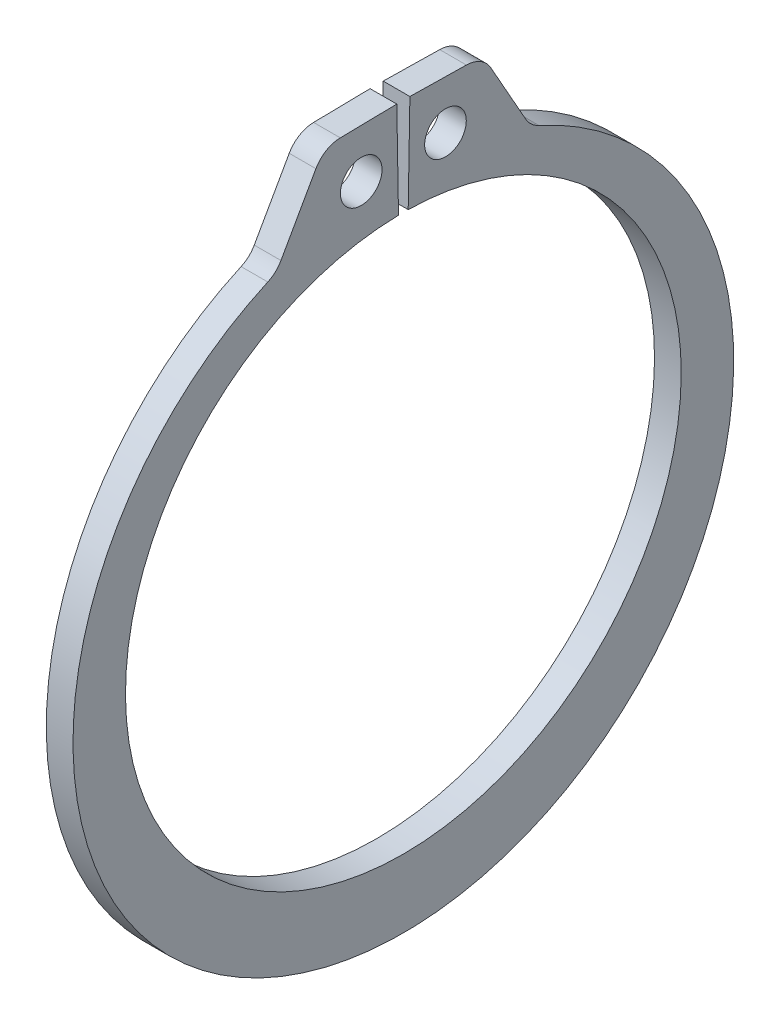
ISO-10303-21;
HEADER;
FILE_DESCRIPTION(('STEP AP214'),'2;1');
FILE_NAME('part.step','',(''),(''),'','','');
FILE_SCHEMA(('AUTOMOTIVE_DESIGN { 1 0 10303 214 1 1 1 1 }'));
ENDSEC;
DATA;
#1=APPLICATION_CONTEXT('core data for automotive mechanical design processes');
#2=APPLICATION_PROTOCOL_DEFINITION('international standard','automotive_design',2000,#1);
#3=PRODUCT_CONTEXT('',#1,'mechanical');
#4=PRODUCT('Part','Part','',(#3));
#5=PRODUCT_RELATED_PRODUCT_CATEGORY('part','',(#4));
#6=PRODUCT_DEFINITION_FORMATION('','',#4);
#7=PRODUCT_DEFINITION_CONTEXT('part definition',#1,'design');
#8=PRODUCT_DEFINITION('design','',#6,#7);
#9=PRODUCT_DEFINITION_SHAPE('','',#8);
#10=(LENGTH_UNIT() NAMED_UNIT(*) SI_UNIT(.MILLI.,.METRE.));
#11=(NAMED_UNIT(*) PLANE_ANGLE_UNIT() SI_UNIT($,.RADIAN.));
#12=(NAMED_UNIT(*) SI_UNIT($,.STERADIAN.) SOLID_ANGLE_UNIT());
#13=UNCERTAINTY_MEASURE_WITH_UNIT(LENGTH_MEASURE(1.E-05),#10,'distance_accuracy_value','');
#14=(GEOMETRIC_REPRESENTATION_CONTEXT(3) GLOBAL_UNCERTAINTY_ASSIGNED_CONTEXT((#13)) GLOBAL_UNIT_ASSIGNED_CONTEXT((#10,
#11,#12)) REPRESENTATION_CONTEXT('',''));
#15=CARTESIAN_POINT('',(0.,0.,0.));
#16=DIRECTION('',(0.,0.,1.));
#17=DIRECTION('',(1.,0.,0.));
#18=AXIS2_PLACEMENT_3D('',#15,#16,#17);
#19=CARTESIAN_POINT('',(0.635,0.,0.));
#20=DIRECTION('',(1.,0.,0.));
#21=DIRECTION('',(0.,0.,-1.));
#22=AXIS2_PLACEMENT_3D('',#19,#20,#21);
#23=PLANE('',#22);
#24=CARTESIAN_POINT('',(0.635,15.4994797667592,2.0043584939629));
#25=DIRECTION('',(1.,0.,0.));
#26=DIRECTION('',(0.,0.,-1.));
#27=AXIS2_PLACEMENT_3D('',#24,#25,#26);
#28=CIRCLE('',#27,0.9906);
#29=CARTESIAN_POINT('',(0.635,15.4994797667592,1.0137584939629));
#30=VERTEX_POINT('',#29);
#31=EDGE_CURVE('E228',#30,#30,#28,.T.);
#32=ORIENTED_EDGE('',*,*,#31,.F.);
#33=EDGE_LOOP('',(#32));
#34=FACE_BOUND('',#33,.T.);
#35=DIRECTION('',(0.,-0.0174524064372802,0.999847695156391));
#36=VECTOR('',#35,1.);
#37=CARTESIAN_POINT('',(0.635,17.8407823485231,0.311412014263668));
#38=LINE('',#37,#36);
#39=CARTESIAN_POINT('',(0.635,17.8407823485231,0.311412014263668));
#40=VERTEX_POINT('',#39);
#41=CARTESIAN_POINT('',(0.635,17.7938535763566,2.99995957106167));
#42=VERTEX_POINT('',#41);
#43=EDGE_CURVE('E140',#40,#42,#38,.T.);
#44=ORIENTED_EDGE('',*,*,#43,.T.);
#45=CARTESIAN_POINT('',(0.635,16.4351605434085,2.97624349595404));
#46=DIRECTION('',(1.,0.,0.));
#47=DIRECTION('',(0.,0.,-1.));
#48=AXIS2_PLACEMENT_3D('',#45,#46,#47);
#49=CIRCLE('',#48,1.3589);
#50=CARTESIAN_POINT('',(0.635,17.1023893458658,4.16005722081599));
#51=VERTEX_POINT('',#50);
#52=EDGE_CURVE('E181',#42,#51,#49,.T.);
#53=ORIENTED_EDGE('',*,*,#52,.T.);
#54=DIRECTION('',(0.,-0.87115587965409,0.491006551223207));
#55=VECTOR('',#54,1.);
#56=CARTESIAN_POINT('',(0.635,17.7802731101644,3.77798395814039));
#57=LINE('',#56,#55);
#58=CARTESIAN_POINT('',(0.635,14.1508937957615,5.82359836753104));
#59=VERTEX_POINT('',#58);
#60=EDGE_CURVE('E220',#51,#59,#57,.T.);
#61=ORIENTED_EDGE('',*,*,#60,.T.);
#62=CARTESIAN_POINT('',(0.635,14.8181225982187,7.00741209239298));
#63=DIRECTION('',(1.,0.,0.));
#64=DIRECTION('',(0.,0.,-1.));
#65=AXIS2_PLACEMENT_3D('',#62,#63,#64);
#66=CIRCLE('',#65,1.3589);
#67=CARTESIAN_POINT('',(0.635,13.5789066113655,6.44978054026611));
#68=VERTEX_POINT('',#67);
#69=EDGE_CURVE('E188',#59,#68,#66,.F.);
#70=ORIENTED_EDGE('',*,*,#69,.T.);
#71=CARTESIAN_POINT('',(0.635,-0.754341080067231,0.));
#72=DIRECTION('',(1.,0.,0.));
#73=DIRECTION('',(0.,0.,-1.));
#74=AXIS2_PLACEMENT_3D('',#71,#72,#73);
#75=CIRCLE('',#74,15.7175589199328);
#76=CARTESIAN_POINT('',(0.635,13.5789066113655,-6.44978054026611));
#77=VERTEX_POINT('',#76);
#78=EDGE_CURVE('E213',#68,#77,#75,.T.);
#79=ORIENTED_EDGE('',*,*,#78,.T.);
#80=CARTESIAN_POINT('',(0.635,14.8181225982187,-7.00741209239298));
#81=DIRECTION('',(1.,0.,0.));
#82=DIRECTION('',(0.,0.,-1.));
#83=AXIS2_PLACEMENT_3D('',#80,#81,#82);
#84=CIRCLE('',#83,1.3589);
#85=CARTESIAN_POINT('',(0.635,14.1508937957615,-5.82359836753104));
#86=VERTEX_POINT('',#85);
#87=EDGE_CURVE('E11',#77,#86,#84,.F.);
#88=ORIENTED_EDGE('',*,*,#87,.T.);
#89=DIRECTION('',(0.,0.87115587965409,0.491006551223207));
#90=VECTOR('',#89,1.);
#91=CARTESIAN_POINT('',(0.635,17.7802731101644,-3.77798395814039));
#92=LINE('',#91,#90);
#93=CARTESIAN_POINT('',(0.635,17.1023893458658,-4.16005722081599));
#94=VERTEX_POINT('',#93);
#95=EDGE_CURVE('E212',#86,#94,#92,.T.);
#96=ORIENTED_EDGE('',*,*,#95,.T.);
#97=CARTESIAN_POINT('',(0.635,16.4351605434085,-2.97624349595404));
#98=DIRECTION('',(1.,0.,0.));
#99=DIRECTION('',(0.,0.,-1.));
#100=AXIS2_PLACEMENT_3D('',#97,#98,#99);
#101=CIRCLE('',#100,1.3589);
#102=CARTESIAN_POINT('',(0.635,17.7938535763566,-2.99995957106166));
#103=VERTEX_POINT('',#102);
#104=EDGE_CURVE('E56',#94,#103,#101,.T.);
#105=ORIENTED_EDGE('',*,*,#104,.T.);
#106=DIRECTION('',(0.,0.0174524064372802,0.999847695156391));
#107=VECTOR('',#106,1.);
#108=CARTESIAN_POINT('',(0.635,17.8407823485231,-0.311412014263668));
#109=LINE('',#108,#107);
#110=CARTESIAN_POINT('',(0.635,17.8407823485231,-0.311412014263668));
#111=VERTEX_POINT('',#110);
#112=EDGE_CURVE('E217',#103,#111,#109,.T.);
#113=ORIENTED_EDGE('',*,*,#112,.T.);
#114=DIRECTION('',(0.,-0.999847695156391,0.0174524064372835));
#115=VECTOR('',#114,1.);
#116=CARTESIAN_POINT('',(0.635,13.2186864233541,-0.230733029785394));
#117=LINE('',#116,#115);
#118=CARTESIAN_POINT('',(0.635,13.2186864233541,-0.230733029785394));
#119=VERTEX_POINT('',#118);
#120=EDGE_CURVE('E146',#111,#119,#117,.T.);
#121=ORIENTED_EDGE('',*,*,#120,.T.);
#122=CARTESIAN_POINT('',(0.635,0.,0.));
#123=DIRECTION('',(-1.,0.,0.));
#124=DIRECTION('',(0.,0.,-1.));
#125=AXIS2_PLACEMENT_3D('',#122,#123,#124);
#126=CIRCLE('',#125,13.2207);
#127=CARTESIAN_POINT('',(0.635,13.2186864233541,0.230733029785394));
#128=VERTEX_POINT('',#127);
#129=EDGE_CURVE('E141',#119,#128,#126,.T.);
#130=ORIENTED_EDGE('',*,*,#129,.T.);
#131=DIRECTION('',(0.,0.999847695156391,0.0174524064372835));
#132=VECTOR('',#131,1.);
#133=CARTESIAN_POINT('',(0.635,13.2186864233541,0.230733029785394));
#134=LINE('',#133,#132);
#135=EDGE_CURVE('E132',#128,#40,#134,.T.);
#136=ORIENTED_EDGE('',*,*,#135,.T.);
#137=EDGE_LOOP('',(#44,#53,#61,#70,#79,#88,#96,#105,#113,#121,#130,#136));
#138=FACE_BOUND('',#137,.T.);
#139=CARTESIAN_POINT('',(0.635,15.4994797667592,-2.0043584939629));
#140=DIRECTION('',(1.,0.,0.));
#141=DIRECTION('',(0.,0.,-1.));
#142=AXIS2_PLACEMENT_3D('',#139,#140,#141);
#143=CIRCLE('',#142,0.9906);
#144=CARTESIAN_POINT('',(0.635,15.4994797667592,-2.9949584939629));
#145=VERTEX_POINT('',#144);
#146=EDGE_CURVE('E254',#145,#145,#143,.T.);
#147=ORIENTED_EDGE('',*,*,#146,.F.);
#148=EDGE_LOOP('',(#147));
#149=FACE_BOUND('',#148,.T.);
#150=ADVANCED_FACE('F41',(#34,#138,#149),#23,.T.);
#151=CARTESIAN_POINT('',(-0.635,0.,0.));
#152=DIRECTION('',(1.,0.,0.));
#153=DIRECTION('',(0.,0.,-1.));
#154=AXIS2_PLACEMENT_3D('',#151,#152,#153);
#155=PLANE('',#154);
#156=CARTESIAN_POINT('',(-0.635,15.4994797667592,2.0043584939629));
#157=DIRECTION('',(1.,0.,0.));
#158=DIRECTION('',(0.,0.,-1.));
#159=AXIS2_PLACEMENT_3D('',#156,#157,#158);
#160=CIRCLE('',#159,0.9906);
#161=CARTESIAN_POINT('',(-0.635,15.4994797667592,1.0137584939629));
#162=VERTEX_POINT('',#161);
#163=EDGE_CURVE('E251',#162,#162,#160,.T.);
#164=ORIENTED_EDGE('',*,*,#163,.T.);
#165=EDGE_LOOP('',(#164));
#166=FACE_BOUND('',#165,.T.);
#167=DIRECTION('',(0.,-0.87115587965409,0.491006551223207));
#168=VECTOR('',#167,1.);
#169=CARTESIAN_POINT('',(-0.635,17.7802731101644,3.77798395814039));
#170=LINE('',#169,#168);
#171=CARTESIAN_POINT('',(-0.635,17.1023893458658,4.16005722081599));
#172=VERTEX_POINT('',#171);
#173=CARTESIAN_POINT('',(-0.635,14.1508937957615,5.82359836753104));
#174=VERTEX_POINT('',#173);
#175=EDGE_CURVE('E207',#172,#174,#170,.T.);
#176=ORIENTED_EDGE('',*,*,#175,.F.);
#177=CARTESIAN_POINT('',(-0.635,16.4351605434085,2.97624349595404));
#178=DIRECTION('',(1.,0.,0.));
#179=DIRECTION('',(0.,0.,-1.));
#180=AXIS2_PLACEMENT_3D('',#177,#178,#179);
#181=CIRCLE('',#180,1.3589);
#182=CARTESIAN_POINT('',(-0.635,17.7938535763566,2.99995957106167));
#183=VERTEX_POINT('',#182);
#184=EDGE_CURVE('E177',#172,#183,#181,.F.);
#185=ORIENTED_EDGE('',*,*,#184,.T.);
#186=DIRECTION('',(0.,-0.0174524064372802,0.999847695156391));
#187=VECTOR('',#186,1.);
#188=CARTESIAN_POINT('',(-0.635,17.8407823485231,0.311412014263668));
#189=LINE('',#188,#187);
#190=CARTESIAN_POINT('',(-0.635,17.8407823485231,0.311412014263668));
#191=VERTEX_POINT('',#190);
#192=EDGE_CURVE('E230',#191,#183,#189,.T.);
#193=ORIENTED_EDGE('',*,*,#192,.F.);
#194=DIRECTION('',(0.,0.999847695156391,0.0174524064372835));
#195=VECTOR('',#194,1.);
#196=CARTESIAN_POINT('',(-0.635,13.2186864233541,0.230733029785394));
#197=LINE('',#196,#195);
#198=CARTESIAN_POINT('',(-0.635,13.2186864233541,0.230733029785394));
#199=VERTEX_POINT('',#198);
#200=EDGE_CURVE('E227',#199,#191,#197,.T.);
#201=ORIENTED_EDGE('',*,*,#200,.F.);
#202=CARTESIAN_POINT('',(-0.635,0.,0.));
#203=DIRECTION('',(-1.,0.,0.));
#204=DIRECTION('',(0.,0.,-1.));
#205=AXIS2_PLACEMENT_3D('',#202,#203,#204);
#206=CIRCLE('',#205,13.2207);
#207=CARTESIAN_POINT('',(-0.635,13.2186864233541,-0.230733029785394));
#208=VERTEX_POINT('',#207);
#209=EDGE_CURVE('E154',#208,#199,#206,.T.);
#210=ORIENTED_EDGE('',*,*,#209,.F.);
#211=DIRECTION('',(0.,-0.999847695156391,0.0174524064372835));
#212=VECTOR('',#211,1.);
#213=CARTESIAN_POINT('',(-0.635,13.2186864233541,-0.230733029785394));
#214=LINE('',#213,#212);
#215=CARTESIAN_POINT('',(-0.635,17.8407823485231,-0.311412014263668));
#216=VERTEX_POINT('',#215);
#217=EDGE_CURVE('E150',#216,#208,#214,.T.);
#218=ORIENTED_EDGE('',*,*,#217,.F.);
#219=DIRECTION('',(0.,0.0174524064372802,0.999847695156391));
#220=VECTOR('',#219,1.);
#221=CARTESIAN_POINT('',(-0.635,17.8407823485231,-0.311412014263668));
#222=LINE('',#221,#220);
#223=CARTESIAN_POINT('',(-0.635,17.7938535763566,-2.99995957106166));
#224=VERTEX_POINT('',#223);
#225=EDGE_CURVE('E235',#224,#216,#222,.T.);
#226=ORIENTED_EDGE('',*,*,#225,.F.);
#227=CARTESIAN_POINT('',(-0.635,16.4351605434085,-2.97624349595404));
#228=DIRECTION('',(1.,0.,0.));
#229=DIRECTION('',(0.,0.,-1.));
#230=AXIS2_PLACEMENT_3D('',#227,#228,#229);
#231=CIRCLE('',#230,1.3589);
#232=CARTESIAN_POINT('',(-0.635,17.1023893458658,-4.16005722081599));
#233=VERTEX_POINT('',#232);
#234=EDGE_CURVE('E175',#224,#233,#231,.F.);
#235=ORIENTED_EDGE('',*,*,#234,.T.);
#236=DIRECTION('',(0.,0.87115587965409,0.491006551223207));
#237=VECTOR('',#236,1.);
#238=CARTESIAN_POINT('',(-0.635,17.7802731101644,-3.77798395814039));
#239=LINE('',#238,#237);
#240=CARTESIAN_POINT('',(-0.635,14.1508937957615,-5.82359836753104));
#241=VERTEX_POINT('',#240);
#242=EDGE_CURVE('E198',#241,#233,#239,.T.);
#243=ORIENTED_EDGE('',*,*,#242,.F.);
#244=CARTESIAN_POINT('',(-0.635,14.8181225982187,-7.00741209239298));
#245=DIRECTION('',(1.,0.,0.));
#246=DIRECTION('',(0.,0.,-1.));
#247=AXIS2_PLACEMENT_3D('',#244,#245,#246);
#248=CIRCLE('',#247,1.3589);
#249=CARTESIAN_POINT('',(-0.635,13.5789066113655,-6.44978054026611));
#250=VERTEX_POINT('',#249);
#251=EDGE_CURVE('E49',#241,#250,#248,.T.);
#252=ORIENTED_EDGE('',*,*,#251,.T.);
#253=CARTESIAN_POINT('',(-0.635,-0.754341080067231,0.));
#254=DIRECTION('',(1.,0.,0.));
#255=DIRECTION('',(0.,0.,-1.));
#256=AXIS2_PLACEMENT_3D('',#253,#254,#255);
#257=CIRCLE('',#256,15.7175589199328);
#258=CARTESIAN_POINT('',(-0.635,13.5789066113655,6.44978054026611));
#259=VERTEX_POINT('',#258);
#260=EDGE_CURVE('E196',#259,#250,#257,.T.);
#261=ORIENTED_EDGE('',*,*,#260,.F.);
#262=CARTESIAN_POINT('',(-0.635,14.8181225982187,7.00741209239298));
#263=DIRECTION('',(1.,0.,0.));
#264=DIRECTION('',(0.,0.,-1.));
#265=AXIS2_PLACEMENT_3D('',#262,#263,#264);
#266=CIRCLE('',#265,1.3589);
#267=EDGE_CURVE('E186',#259,#174,#266,.T.);
#268=ORIENTED_EDGE('',*,*,#267,.T.);
#269=EDGE_LOOP('',(#176,#185,#193,#201,#210,#218,#226,#235,#243,#252,#261,#268));
#270=FACE_BOUND('',#269,.T.);
#271=CARTESIAN_POINT('',(-0.635,15.4994797667592,-2.0043584939629));
#272=DIRECTION('',(1.,0.,0.));
#273=DIRECTION('',(0.,0.,-1.));
#274=AXIS2_PLACEMENT_3D('',#271,#272,#273);
#275=CIRCLE('',#274,0.9906);
#276=CARTESIAN_POINT('',(-0.635,15.4994797667592,-2.9949584939629));
#277=VERTEX_POINT('',#276);
#278=EDGE_CURVE('E257',#277,#277,#275,.T.);
#279=ORIENTED_EDGE('',*,*,#278,.T.);
#280=EDGE_LOOP('',(#279));
#281=FACE_BOUND('',#280,.T.);
#282=ADVANCED_FACE('F194',(#166,#270,#281),#155,.F.);
#283=CARTESIAN_POINT('',(0.635,0.,0.));
#284=DIRECTION('',(-1.,0.,0.));
#285=DIRECTION('',(0.,0.,1.));
#286=AXIS2_PLACEMENT_3D('',#283,#284,#285);
#287=CYLINDRICAL_SURFACE('',#286,13.2207);
#288=ORIENTED_EDGE('',*,*,#209,.T.);
#289=DIRECTION('',(-1.,0.,0.));
#290=VECTOR('',#289,1.);
#291=CARTESIAN_POINT('',(0.635,13.2186864233541,0.230733029785394));
#292=LINE('',#291,#290);
#293=EDGE_CURVE('E136',#128,#199,#292,.T.);
#294=ORIENTED_EDGE('',*,*,#293,.F.);
#295=ORIENTED_EDGE('',*,*,#129,.F.);
#296=DIRECTION('',(-1.,0.,0.));
#297=VECTOR('',#296,1.);
#298=CARTESIAN_POINT('',(0.635,13.2186864233541,-0.230733029785394));
#299=LINE('',#298,#297);
#300=EDGE_CURVE('E225',#119,#208,#299,.T.);
#301=ORIENTED_EDGE('',*,*,#300,.T.);
#302=EDGE_LOOP('',(#288,#294,#295,#301));
#303=FACE_BOUND('',#302,.T.);
#304=ADVANCED_FACE('F152',(#303),#287,.F.);
#305=CARTESIAN_POINT('',(0.635,13.2186864233541,0.230733029785394));
#306=DIRECTION('',(0.,-0.0174524064372835,0.999847695156391));
#307=DIRECTION('',(0.,-0.999847695156391,-0.0174524064372835));
#308=AXIS2_PLACEMENT_3D('',#305,#306,#307);
#309=PLANE('',#308);
#310=ORIENTED_EDGE('',*,*,#200,.T.);
#311=DIRECTION('',(-1.,0.,0.));
#312=VECTOR('',#311,1.);
#313=CARTESIAN_POINT('',(0.635,17.8407823485231,0.311412014263668));
#314=LINE('',#313,#312);
#315=EDGE_CURVE('E139',#40,#191,#314,.T.);
#316=ORIENTED_EDGE('',*,*,#315,.F.);
#317=ORIENTED_EDGE('',*,*,#135,.F.);
#318=ORIENTED_EDGE('',*,*,#293,.T.);
#319=EDGE_LOOP('',(#310,#316,#317,#318));
#320=FACE_BOUND('',#319,.T.);
#321=ADVANCED_FACE('F134',(#320),#309,.F.);
#322=CARTESIAN_POINT('',(0.635,17.8407823485231,0.311412014263668));
#323=DIRECTION('',(0.,-0.999847695156391,-0.0174524064372802));
#324=DIRECTION('',(0.,0.0174524064372802,-0.999847695156391));
#325=AXIS2_PLACEMENT_3D('',#322,#323,#324);
#326=PLANE('',#325);
#327=ORIENTED_EDGE('',*,*,#192,.T.);
#328=DIRECTION('',(-1.,0.,0.));
#329=VECTOR('',#328,1.);
#330=CARTESIAN_POINT('',(0.635,17.7938535763566,2.99995957106167));
#331=LINE('',#330,#329);
#332=EDGE_CURVE('E64',#183,#42,#331,.F.);
#333=ORIENTED_EDGE('',*,*,#332,.T.);
#334=ORIENTED_EDGE('',*,*,#43,.F.);
#335=ORIENTED_EDGE('',*,*,#315,.T.);
#336=EDGE_LOOP('',(#327,#333,#334,#335));
#337=FACE_BOUND('',#336,.T.);
#338=ADVANCED_FACE('F246',(#337),#326,.F.);
#339=CARTESIAN_POINT('',(0.635,17.7802731101644,3.77798395814039));
#340=DIRECTION('',(0.,-0.491006551223207,-0.87115587965409));
#341=DIRECTION('',(0.,0.87115587965409,-0.491006551223207));
#342=AXIS2_PLACEMENT_3D('',#339,#340,#341);
#343=PLANE('',#342);
#344=ORIENTED_EDGE('',*,*,#175,.T.);
#345=DIRECTION('',(1.,0.,0.));
#346=VECTOR('',#345,1.);
#347=CARTESIAN_POINT('',(0.635,14.1508937957615,5.82359836753103));
#348=LINE('',#347,#346);
#349=EDGE_CURVE('E168',#174,#59,#348,.T.);
#350=ORIENTED_EDGE('',*,*,#349,.T.);
#351=ORIENTED_EDGE('',*,*,#60,.F.);
#352=DIRECTION('',(-1.,0.,0.));
#353=VECTOR('',#352,1.);
#354=CARTESIAN_POINT('',(0.635,17.1023893458658,4.16005722081599));
#355=LINE('',#354,#353);
#356=EDGE_CURVE('E165',#51,#172,#355,.T.);
#357=ORIENTED_EDGE('',*,*,#356,.T.);
#358=EDGE_LOOP('',(#344,#350,#351,#357));
#359=FACE_BOUND('',#358,.T.);
#360=ADVANCED_FACE('F287',(#359),#343,.F.);
#361=CARTESIAN_POINT('',(0.635,-0.754341080067231,0.));
#362=DIRECTION('',(-1.,0.,0.));
#363=DIRECTION('',(0.,0.,1.));
#364=AXIS2_PLACEMENT_3D('',#361,#362,#363);
#365=CYLINDRICAL_SURFACE('',#364,15.7175589199328);
#366=ORIENTED_EDGE('',*,*,#78,.F.);
#367=DIRECTION('',(-1.,0.,0.));
#368=VECTOR('',#367,1.);
#369=CARTESIAN_POINT('',(0.635,13.5789066113655,6.44978054026611));
#370=LINE('',#369,#368);
#371=EDGE_CURVE('E157',#68,#259,#370,.T.);
#372=ORIENTED_EDGE('',*,*,#371,.T.);
#373=ORIENTED_EDGE('',*,*,#260,.T.);
#374=DIRECTION('',(-1.,0.,0.));
#375=VECTOR('',#374,1.);
#376=CARTESIAN_POINT('',(0.635,13.5789066113655,-6.44978054026611));
#377=LINE('',#376,#375);
#378=EDGE_CURVE('E155',#250,#77,#377,.F.);
#379=ORIENTED_EDGE('',*,*,#378,.T.);
#380=EDGE_LOOP('',(#366,#372,#373,#379));
#381=FACE_BOUND('',#380,.T.);
#382=ADVANCED_FACE('F204',(#381),#365,.T.);
#383=CARTESIAN_POINT('',(0.635,17.7802731101644,-3.77798395814039));
#384=DIRECTION('',(0.,-0.491006551223207,0.87115587965409));
#385=DIRECTION('',(0.,-0.87115587965409,-0.491006551223207));
#386=AXIS2_PLACEMENT_3D('',#383,#384,#385);
#387=PLANE('',#386);
#388=ORIENTED_EDGE('',*,*,#95,.F.);
#389=DIRECTION('',(1.,0.,0.));
#390=VECTOR('',#389,1.);
#391=CARTESIAN_POINT('',(-0.635,14.1508937957615,-5.82359836753103));
#392=LINE('',#391,#390);
#393=EDGE_CURVE('E172',#86,#241,#392,.F.);
#394=ORIENTED_EDGE('',*,*,#393,.T.);
#395=ORIENTED_EDGE('',*,*,#242,.T.);
#396=DIRECTION('',(-1.,0.,0.));
#397=VECTOR('',#396,1.);
#398=CARTESIAN_POINT('',(0.635,17.1023893458658,-4.16005722081599));
#399=LINE('',#398,#397);
#400=EDGE_CURVE('E170',#233,#94,#399,.F.);
#401=ORIENTED_EDGE('',*,*,#400,.T.);
#402=EDGE_LOOP('',(#388,#394,#395,#401));
#403=FACE_BOUND('',#402,.T.);
#404=ADVANCED_FACE('F215',(#403),#387,.F.);
#405=CARTESIAN_POINT('',(0.635,17.8407823485231,-0.311412014263668));
#406=DIRECTION('',(0.,-0.999847695156391,0.0174524064372802));
#407=DIRECTION('',(0.,-0.0174524064372802,-0.999847695156391));
#408=AXIS2_PLACEMENT_3D('',#405,#406,#407);
#409=PLANE('',#408);
#410=ORIENTED_EDGE('',*,*,#112,.F.);
#411=DIRECTION('',(-1.,0.,0.));
#412=VECTOR('',#411,1.);
#413=CARTESIAN_POINT('',(0.635,17.7938535763566,-2.99995957106166));
#414=LINE('',#413,#412);
#415=EDGE_CURVE('E183',#103,#224,#414,.T.);
#416=ORIENTED_EDGE('',*,*,#415,.T.);
#417=ORIENTED_EDGE('',*,*,#225,.T.);
#418=DIRECTION('',(-1.,0.,0.));
#419=VECTOR('',#418,1.);
#420=CARTESIAN_POINT('',(0.635,17.8407823485231,-0.311412014263668));
#421=LINE('',#420,#419);
#422=EDGE_CURVE('E159',#111,#216,#421,.T.);
#423=ORIENTED_EDGE('',*,*,#422,.F.);
#424=EDGE_LOOP('',(#410,#416,#417,#423));
#425=FACE_BOUND('',#424,.T.);
#426=ADVANCED_FACE('F280',(#425),#409,.F.);
#427=CARTESIAN_POINT('',(0.635,13.2186864233541,-0.230733029785394));
#428=DIRECTION('',(0.,-0.0174524064372835,-0.999847695156391));
#429=DIRECTION('',(0.,0.999847695156391,-0.0174524064372835));
#430=AXIS2_PLACEMENT_3D('',#427,#428,#429);
#431=PLANE('',#430);
#432=ORIENTED_EDGE('',*,*,#217,.T.);
#433=ORIENTED_EDGE('',*,*,#300,.F.);
#434=ORIENTED_EDGE('',*,*,#120,.F.);
#435=ORIENTED_EDGE('',*,*,#422,.T.);
#436=EDGE_LOOP('',(#432,#433,#434,#435));
#437=FACE_BOUND('',#436,.T.);
#438=ADVANCED_FACE('F242',(#437),#431,.F.);
#439=CARTESIAN_POINT('',(0.635,15.4994797667592,2.0043584939629));
#440=DIRECTION('',(-1.,0.,0.));
#441=DIRECTION('',(0.,0.,1.));
#442=AXIS2_PLACEMENT_3D('',#439,#440,#441);
#443=CYLINDRICAL_SURFACE('',#442,0.9906);
#444=ORIENTED_EDGE('',*,*,#31,.T.);
#445=EDGE_LOOP('',(#444));
#446=FACE_BOUND('',#445,.T.);
#447=ORIENTED_EDGE('',*,*,#163,.F.);
#448=EDGE_LOOP('',(#447));
#449=FACE_BOUND('',#448,.T.);
#450=ADVANCED_FACE('F275',(#446,#449),#443,.F.);
#451=CARTESIAN_POINT('',(0.635,15.4994797667592,-2.0043584939629));
#452=DIRECTION('',(-1.,0.,0.));
#453=DIRECTION('',(0.,0.,1.));
#454=AXIS2_PLACEMENT_3D('',#451,#452,#453);
#455=CYLINDRICAL_SURFACE('',#454,0.9906);
#456=ORIENTED_EDGE('',*,*,#146,.T.);
#457=EDGE_LOOP('',(#456));
#458=FACE_BOUND('',#457,.T.);
#459=ORIENTED_EDGE('',*,*,#278,.F.);
#460=EDGE_LOOP('',(#459));
#461=FACE_BOUND('',#460,.T.);
#462=ADVANCED_FACE('F263',(#458,#461),#455,.F.);
#463=CARTESIAN_POINT('',(0.635,14.8181225982187,7.00741209239298));
#464=DIRECTION('',(-1.,0.,0.));
#465=DIRECTION('',(0.,0.,1.));
#466=AXIS2_PLACEMENT_3D('',#463,#464,#465);
#467=CYLINDRICAL_SURFACE('',#466,1.3589);
#468=ORIENTED_EDGE('',*,*,#69,.F.);
#469=ORIENTED_EDGE('',*,*,#349,.F.);
#470=ORIENTED_EDGE('',*,*,#267,.F.);
#471=ORIENTED_EDGE('',*,*,#371,.F.);
#472=EDGE_LOOP('',(#468,#469,#470,#471));
#473=FACE_BOUND('',#472,.T.);
#474=ADVANCED_FACE('F297',(#473),#467,.F.);
#475=CARTESIAN_POINT('',(0.635,14.8181225982187,-7.00741209239298));
#476=DIRECTION('',(-1.,0.,0.));
#477=DIRECTION('',(0.,0.,1.));
#478=AXIS2_PLACEMENT_3D('',#475,#476,#477);
#479=CYLINDRICAL_SURFACE('',#478,1.3589);
#480=ORIENTED_EDGE('',*,*,#87,.F.);
#481=ORIENTED_EDGE('',*,*,#378,.F.);
#482=ORIENTED_EDGE('',*,*,#251,.F.);
#483=ORIENTED_EDGE('',*,*,#393,.F.);
#484=EDGE_LOOP('',(#480,#481,#482,#483));
#485=FACE_BOUND('',#484,.T.);
#486=ADVANCED_FACE('F210',(#485),#479,.F.);
#487=CARTESIAN_POINT('',(0.635,16.4351605434085,2.97624349595404));
#488=DIRECTION('',(-1.,0.,0.));
#489=DIRECTION('',(0.,0.,1.));
#490=AXIS2_PLACEMENT_3D('',#487,#488,#489);
#491=CYLINDRICAL_SURFACE('',#490,1.3589);
#492=ORIENTED_EDGE('',*,*,#52,.F.);
#493=ORIENTED_EDGE('',*,*,#332,.F.);
#494=ORIENTED_EDGE('',*,*,#184,.F.);
#495=ORIENTED_EDGE('',*,*,#356,.F.);
#496=EDGE_LOOP('',(#492,#493,#494,#495));
#497=FACE_BOUND('',#496,.T.);
#498=ADVANCED_FACE('F302',(#497),#491,.T.);
#499=CARTESIAN_POINT('',(0.635,16.4351605434085,-2.97624349595404));
#500=DIRECTION('',(-1.,0.,0.));
#501=DIRECTION('',(0.,0.,1.));
#502=AXIS2_PLACEMENT_3D('',#499,#500,#501);
#503=CYLINDRICAL_SURFACE('',#502,1.3589);
#504=ORIENTED_EDGE('',*,*,#104,.F.);
#505=ORIENTED_EDGE('',*,*,#400,.F.);
#506=ORIENTED_EDGE('',*,*,#234,.F.);
#507=ORIENTED_EDGE('',*,*,#415,.F.);
#508=EDGE_LOOP('',(#504,#505,#506,#507));
#509=FACE_BOUND('',#508,.T.);
#510=ADVANCED_FACE('F43',(#509),#503,.T.);
#511=CLOSED_SHELL('',(#150,#282,#304,#321,#338,#360,#382,#404,#426,#438,#450,#462,#474,#486,
#498,#510));
#512=MANIFOLD_SOLID_BREP('B2',#511);
#513=ADVANCED_BREP_SHAPE_REPRESENTATION('',(#18,#512),#14);
#514=SHAPE_DEFINITION_REPRESENTATION(#9,#513);
ENDSEC;
END-ISO-10303-21;
